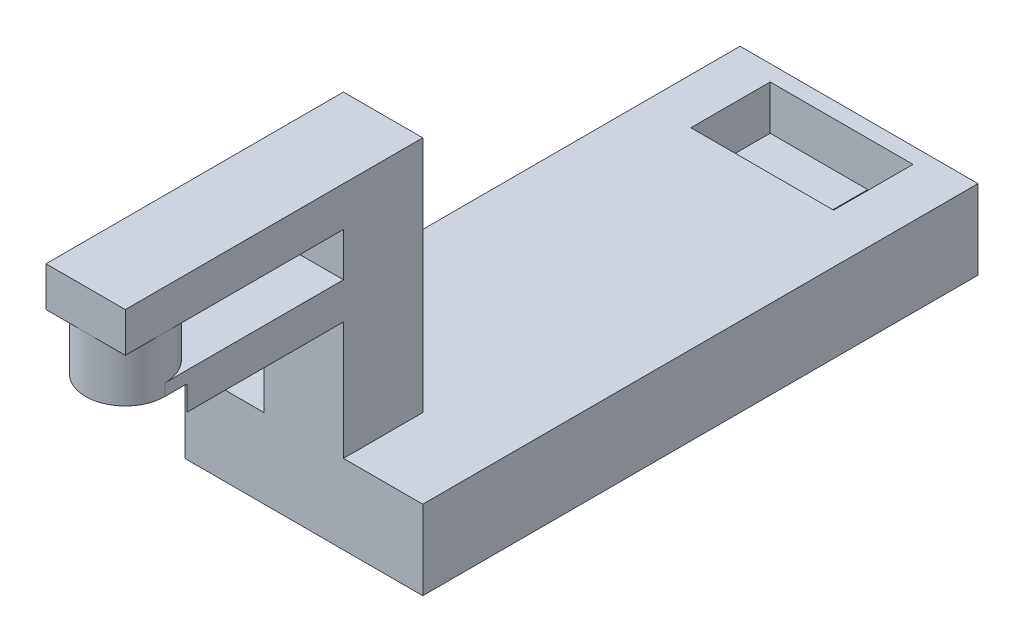
ISO-10303-21;
HEADER;
FILE_DESCRIPTION(('STEP AP214'),'2;1');
FILE_NAME('part.step','',(''),(''),'','','');
FILE_SCHEMA(('AUTOMOTIVE_DESIGN { 1 0 10303 214 1 1 1 1 }'));
ENDSEC;
DATA;
#1=APPLICATION_CONTEXT('core data for automotive mechanical design processes');
#2=APPLICATION_PROTOCOL_DEFINITION('international standard','automotive_design',2000,#1);
#3=PRODUCT_CONTEXT('',#1,'mechanical');
#4=PRODUCT('Part','Part','',(#3));
#5=PRODUCT_RELATED_PRODUCT_CATEGORY('part','',(#4));
#6=PRODUCT_DEFINITION_FORMATION('','',#4);
#7=PRODUCT_DEFINITION_CONTEXT('part definition',#1,'design');
#8=PRODUCT_DEFINITION('design','',#6,#7);
#9=PRODUCT_DEFINITION_SHAPE('','',#8);
#10=(LENGTH_UNIT() NAMED_UNIT(*) SI_UNIT(.MILLI.,.METRE.));
#11=(NAMED_UNIT(*) PLANE_ANGLE_UNIT() SI_UNIT($,.RADIAN.));
#12=(NAMED_UNIT(*) SI_UNIT($,.STERADIAN.) SOLID_ANGLE_UNIT());
#13=UNCERTAINTY_MEASURE_WITH_UNIT(LENGTH_MEASURE(1.E-05),#10,'distance_accuracy_value','');
#14=(GEOMETRIC_REPRESENTATION_CONTEXT(3) GLOBAL_UNCERTAINTY_ASSIGNED_CONTEXT((#13)) GLOBAL_UNIT_ASSIGNED_CONTEXT((#10,
#11,#12)) REPRESENTATION_CONTEXT('',''));
#15=CARTESIAN_POINT('',(0.,0.,0.));
#16=DIRECTION('',(0.,0.,1.));
#17=DIRECTION('',(1.,0.,0.));
#18=AXIS2_PLACEMENT_3D('',#15,#16,#17);
#19=CARTESIAN_POINT('',(0.,-19.812,0.));
#20=DIRECTION('',(0.,1.,0.));
#21=DIRECTION('',(0.,0.,1.));
#22=AXIS2_PLACEMENT_3D('',#19,#20,#21);
#23=PLANE('',#22);
#24=DIRECTION('',(0.,0.,1.));
#25=VECTOR('',#24,1.);
#26=CARTESIAN_POINT('',(3.937,-19.812,-73.66));
#27=LINE('',#26,#25);
#28=CARTESIAN_POINT('',(3.937,-19.812,-73.66));
#29=VERTEX_POINT('',#28);
#30=CARTESIAN_POINT('',(3.937,-19.812,-60.96));
#31=VERTEX_POINT('',#30);
#32=EDGE_CURVE('E273',#29,#31,#27,.T.);
#33=ORIENTED_EDGE('',*,*,#32,.F.);
#34=DIRECTION('',(-1.,0.,0.));
#35=VECTOR('',#34,1.);
#36=CARTESIAN_POINT('',(-11.684,-19.812,-73.66));
#37=LINE('',#36,#35);
#38=CARTESIAN_POINT('',(-11.684,-19.812,-73.66));
#39=VERTEX_POINT('',#38);
#40=EDGE_CURVE('E312',#29,#39,#37,.T.);
#41=ORIENTED_EDGE('',*,*,#40,.T.);
#42=DIRECTION('',(0.,0.,1.));
#43=VECTOR('',#42,1.);
#44=CARTESIAN_POINT('',(-11.684,-19.812,-73.66));
#45=LINE('',#44,#43);
#46=CARTESIAN_POINT('',(-11.684,-19.812,-60.96));
#47=VERTEX_POINT('',#46);
#48=EDGE_CURVE('E302',#39,#47,#45,.T.);
#49=ORIENTED_EDGE('',*,*,#48,.T.);
#50=DIRECTION('',(1.,0.,0.));
#51=VECTOR('',#50,1.);
#52=CARTESIAN_POINT('',(-11.684,-19.812,-60.96));
#53=LINE('',#52,#51);
#54=EDGE_CURVE('E307',#47,#31,#53,.T.);
#55=ORIENTED_EDGE('',*,*,#54,.T.);
#56=EDGE_LOOP('',(#33,#41,#49,#55));
#57=FACE_BOUND('',#56,.T.);
#58=ADVANCED_FACE('F61',(#57),#23,.T.);
#59=CARTESIAN_POINT('',(-6.35,-25.4,12.7));
#60=DIRECTION('',(1.,0.,0.));
#61=DIRECTION('',(0.,0.,-1.));
#62=AXIS2_PLACEMENT_3D('',#59,#60,#61);
#63=PLANE('',#62);
#64=DIRECTION('',(0.,0.,-1.));
#65=VECTOR('',#64,1.);
#66=CARTESIAN_POINT('',(-6.35,-12.7,12.7));
#67=LINE('',#66,#65);
#68=CARTESIAN_POINT('',(-6.35,-12.7,12.7));
#69=VERTEX_POINT('',#68);
#70=CARTESIAN_POINT('',(-6.35,-12.7,0.));
#71=VERTEX_POINT('',#70);
#72=EDGE_CURVE('E364',#69,#71,#67,.T.);
#73=ORIENTED_EDGE('',*,*,#72,.F.);
#74=DIRECTION('',(0.,-1.,0.));
#75=VECTOR('',#74,1.);
#76=CARTESIAN_POINT('',(-6.35,-25.4,12.7));
#77=LINE('',#76,#75);
#78=CARTESIAN_POINT('',(-6.35,6.223,12.7));
#79=VERTEX_POINT('',#78);
#80=EDGE_CURVE('E478',#79,#69,#77,.T.);
#81=ORIENTED_EDGE('',*,*,#80,.F.);
#82=DIRECTION('',(0.,0.,-1.));
#83=VECTOR('',#82,1.);
#84=CARTESIAN_POINT('',(-6.35,6.223,47.625));
#85=LINE('',#84,#83);
#86=CARTESIAN_POINT('',(-6.35,6.223,37.7764288630921));
#87=VERTEX_POINT('',#86);
#88=EDGE_CURVE('E436',#87,#79,#85,.T.);
#89=ORIENTED_EDGE('',*,*,#88,.F.);
#90=DIRECTION('',(0.,-1.,0.));
#91=VECTOR('',#90,1.);
#92=CARTESIAN_POINT('',(-6.35,47.0640986883574,37.7764288630921));
#93=LINE('',#92,#91);
#94=CARTESIAN_POINT('',(-6.35,10.1600000000001,37.7764288630921));
#95=VERTEX_POINT('',#94);
#96=EDGE_CURVE('E420',#95,#87,#93,.T.);
#97=ORIENTED_EDGE('',*,*,#96,.F.);
#98=DIRECTION('',(0.,0.,-1.));
#99=VECTOR('',#98,1.);
#100=CARTESIAN_POINT('',(-6.35,10.1600000000001,0.));
#101=LINE('',#100,#99);
#102=CARTESIAN_POINT('',(-6.35,10.1600000000001,41.275));
#103=VERTEX_POINT('',#102);
#104=EDGE_CURVE('E374',#103,#95,#101,.T.);
#105=ORIENTED_EDGE('',*,*,#104,.F.);
#106=DIRECTION('',(0.,-1.,0.));
#107=VECTOR('',#106,1.);
#108=CARTESIAN_POINT('',(-6.35,28.0302561210692,41.275));
#109=LINE('',#108,#107);
#110=CARTESIAN_POINT('',(-6.35,12.065,41.275));
#111=VERTEX_POINT('',#110);
#112=EDGE_CURVE('E369',#111,#103,#109,.T.);
#113=ORIENTED_EDGE('',*,*,#112,.F.);
#114=DIRECTION('',(0.,0.,-1.));
#115=VECTOR('',#114,1.);
#116=CARTESIAN_POINT('',(-6.35,12.065,47.625));
#117=LINE('',#116,#115);
#118=CARTESIAN_POINT('',(-6.35,12.065,12.7));
#119=VERTEX_POINT('',#118);
#120=EDGE_CURVE('E444',#111,#119,#117,.T.);
#121=ORIENTED_EDGE('',*,*,#120,.T.);
#122=CARTESIAN_POINT('',(-6.35,19.05,12.7));
#123=VERTEX_POINT('',#122);
#124=EDGE_CURVE('E480',#123,#119,#77,.T.);
#125=ORIENTED_EDGE('',*,*,#124,.F.);
#126=DIRECTION('',(0.,0.,-1.));
#127=VECTOR('',#126,1.);
#128=CARTESIAN_POINT('',(-6.35,19.05,47.625));
#129=LINE('',#128,#127);
#130=CARTESIAN_POINT('',(-6.35,19.05,41.275));
#131=VERTEX_POINT('',#130);
#132=EDGE_CURVE('E471',#131,#123,#129,.T.);
#133=ORIENTED_EDGE('',*,*,#132,.F.);
#134=CARTESIAN_POINT('',(-6.35,19.05,47.625));
#135=VERTEX_POINT('',#134);
#136=EDGE_CURVE('E472',#135,#131,#129,.T.);
#137=ORIENTED_EDGE('',*,*,#136,.F.);
#138=DIRECTION('',(0.,-1.,0.));
#139=VECTOR('',#138,1.);
#140=CARTESIAN_POINT('',(-6.35,25.4,47.625));
#141=LINE('',#140,#139);
#142=CARTESIAN_POINT('',(-6.35,25.4,47.625));
#143=VERTEX_POINT('',#142);
#144=EDGE_CURVE('E453',#143,#135,#141,.T.);
#145=ORIENTED_EDGE('',*,*,#144,.F.);
#146=DIRECTION('',(0.,0.,-1.));
#147=VECTOR('',#146,1.);
#148=CARTESIAN_POINT('',(-6.35,25.4,12.7));
#149=LINE('',#148,#147);
#150=CARTESIAN_POINT('',(-6.35,25.4,0.));
#151=VERTEX_POINT('',#150);
#152=EDGE_CURVE('E485',#143,#151,#149,.T.);
#153=ORIENTED_EDGE('',*,*,#152,.T.);
#154=DIRECTION('',(0.,-1.,0.));
#155=VECTOR('',#154,1.);
#156=CARTESIAN_POINT('',(-6.35,-25.4,0.));
#157=LINE('',#156,#155);
#158=EDGE_CURVE('E489',#151,#71,#157,.T.);
#159=ORIENTED_EDGE('',*,*,#158,.T.);
#160=EDGE_LOOP('',(#73,#81,#89,#97,#105,#113,#121,#125,#133,#137,#145,#153,#159));
#161=FACE_BOUND('',#160,.T.);
#162=ADVANCED_FACE('F570',(#161),#63,.F.);
#163=CARTESIAN_POINT('',(6.35,-25.4,12.7));
#164=DIRECTION('',(-1.,0.,0.));
#165=DIRECTION('',(0.,0.,1.));
#166=AXIS2_PLACEMENT_3D('',#163,#164,#165);
#167=PLANE('',#166);
#168=DIRECTION('',(0.,0.,1.));
#169=VECTOR('',#168,1.);
#170=CARTESIAN_POINT('',(6.35,-12.7,12.7));
#171=LINE('',#170,#169);
#172=CARTESIAN_POINT('',(6.35,-12.7,0.));
#173=VERTEX_POINT('',#172);
#174=CARTESIAN_POINT('',(6.35,-12.7,12.7));
#175=VERTEX_POINT('',#174);
#176=EDGE_CURVE('E362',#173,#175,#171,.T.);
#177=ORIENTED_EDGE('',*,*,#176,.F.);
#178=DIRECTION('',(0.,1.,0.));
#179=VECTOR('',#178,1.);
#180=CARTESIAN_POINT('',(6.35,-25.4,0.));
#181=LINE('',#180,#179);
#182=CARTESIAN_POINT('',(6.35,25.4,0.));
#183=VERTEX_POINT('',#182);
#184=EDGE_CURVE('E475',#173,#183,#181,.T.);
#185=ORIENTED_EDGE('',*,*,#184,.T.);
#186=DIRECTION('',(0.,0.,-1.));
#187=VECTOR('',#186,1.);
#188=CARTESIAN_POINT('',(6.35,25.4,12.7));
#189=LINE('',#188,#187);
#190=CARTESIAN_POINT('',(6.35,25.4,47.625));
#191=VERTEX_POINT('',#190);
#192=EDGE_CURVE('E494',#191,#183,#189,.T.);
#193=ORIENTED_EDGE('',*,*,#192,.F.);
#194=DIRECTION('',(0.,1.,0.));
#195=VECTOR('',#194,1.);
#196=CARTESIAN_POINT('',(6.35,25.4,47.625));
#197=LINE('',#196,#195);
#198=CARTESIAN_POINT('',(6.35,19.05,47.625));
#199=VERTEX_POINT('',#198);
#200=EDGE_CURVE('E459',#199,#191,#197,.T.);
#201=ORIENTED_EDGE('',*,*,#200,.F.);
#202=DIRECTION('',(0.,0.,-1.));
#203=VECTOR('',#202,1.);
#204=CARTESIAN_POINT('',(6.35,19.05,47.625));
#205=LINE('',#204,#203);
#206=CARTESIAN_POINT('',(6.35,19.05,41.275));
#207=VERTEX_POINT('',#206);
#208=EDGE_CURVE('E468',#199,#207,#205,.T.);
#209=ORIENTED_EDGE('',*,*,#208,.T.);
#210=CARTESIAN_POINT('',(6.35,19.05,12.7));
#211=VERTEX_POINT('',#210);
#212=EDGE_CURVE('E465',#207,#211,#205,.T.);
#213=ORIENTED_EDGE('',*,*,#212,.T.);
#214=DIRECTION('',(0.,1.,0.));
#215=VECTOR('',#214,1.);
#216=CARTESIAN_POINT('',(6.35,-25.4,12.7));
#217=LINE('',#216,#215);
#218=CARTESIAN_POINT('',(6.35,12.065,12.7));
#219=VERTEX_POINT('',#218);
#220=EDGE_CURVE('E479',#219,#211,#217,.T.);
#221=ORIENTED_EDGE('',*,*,#220,.F.);
#222=DIRECTION('',(0.,0.,-1.));
#223=VECTOR('',#222,1.);
#224=CARTESIAN_POINT('',(6.35,12.065,47.625));
#225=LINE('',#224,#223);
#226=CARTESIAN_POINT('',(6.35,12.065,41.275));
#227=VERTEX_POINT('',#226);
#228=EDGE_CURVE('E442',#227,#219,#225,.T.);
#229=ORIENTED_EDGE('',*,*,#228,.F.);
#230=DIRECTION('',(0.,-1.,0.));
#231=VECTOR('',#230,1.);
#232=CARTESIAN_POINT('',(6.35,28.0302561210692,41.275));
#233=LINE('',#232,#231);
#234=CARTESIAN_POINT('',(6.35,10.1600000000001,41.275));
#235=VERTEX_POINT('',#234);
#236=EDGE_CURVE('E366',#227,#235,#233,.T.);
#237=ORIENTED_EDGE('',*,*,#236,.T.);
#238=DIRECTION('',(0.,0.,1.));
#239=VECTOR('',#238,1.);
#240=CARTESIAN_POINT('',(6.35,10.1600000000001,0.));
#241=LINE('',#240,#239);
#242=CARTESIAN_POINT('',(6.34999999999992,10.1600000000001,37.7764288630922));
#243=VERTEX_POINT('',#242);
#244=EDGE_CURVE('E400',#243,#235,#241,.T.);
#245=ORIENTED_EDGE('',*,*,#244,.F.);
#246=DIRECTION('',(0.,-1.,0.));
#247=VECTOR('',#246,1.);
#248=CARTESIAN_POINT('',(6.35,47.0640986883574,37.7764288630921));
#249=LINE('',#248,#247);
#250=CARTESIAN_POINT('',(6.35,6.223,37.7764288630921));
#251=VERTEX_POINT('',#250);
#252=EDGE_CURVE('E404',#243,#251,#249,.T.);
#253=ORIENTED_EDGE('',*,*,#252,.T.);
#254=DIRECTION('',(0.,0.,-1.));
#255=VECTOR('',#254,1.);
#256=CARTESIAN_POINT('',(6.35,6.223,47.625));
#257=LINE('',#256,#255);
#258=CARTESIAN_POINT('',(6.35,6.223,12.7));
#259=VERTEX_POINT('',#258);
#260=EDGE_CURVE('E439',#251,#259,#257,.T.);
#261=ORIENTED_EDGE('',*,*,#260,.T.);
#262=EDGE_CURVE('E476',#175,#259,#217,.T.);
#263=ORIENTED_EDGE('',*,*,#262,.F.);
#264=EDGE_LOOP('',(#177,#185,#193,#201,#209,#213,#221,#229,#237,#245,#253,#261,#263));
#265=FACE_BOUND('',#264,.T.);
#266=ADVANCED_FACE('F63',(#265),#167,.F.);
#267=CARTESIAN_POINT('',(0.,0.,0.));
#268=DIRECTION('',(0.,0.,-1.));
#269=DIRECTION('',(-1.,0.,0.));
#270=AXIS2_PLACEMENT_3D('',#267,#268,#269);
#271=PLANE('',#270);
#272=ORIENTED_EDGE('',*,*,#184,.F.);
#273=DIRECTION('',(-1.,0.,0.));
#274=VECTOR('',#273,1.);
#275=CARTESIAN_POINT('',(0.,-12.7,0.));
#276=LINE('',#275,#274);
#277=EDGE_CURVE('E12',#173,#71,#276,.T.);
#278=ORIENTED_EDGE('',*,*,#277,.T.);
#279=ORIENTED_EDGE('',*,*,#158,.F.);
#280=DIRECTION('',(-1.,0.,0.));
#281=VECTOR('',#280,1.);
#282=CARTESIAN_POINT('',(-6.35,25.4,0.));
#283=LINE('',#282,#281);
#284=EDGE_CURVE('E487',#183,#151,#283,.T.);
#285=ORIENTED_EDGE('',*,*,#284,.F.);
#286=EDGE_LOOP('',(#272,#278,#279,#285));
#287=FACE_BOUND('',#286,.T.);
#288=ADVANCED_FACE('F692',(#287),#271,.T.);
#289=CARTESIAN_POINT('',(13.800000000144,10.1600000000001,30.9250000001918));
#290=DIRECTION('',(0.,1.,0.));
#291=DIRECTION('',(1.39148345623674E-11,0.,-1.));
#292=AXIS2_PLACEMENT_3D('',#289,#290,#291);
#293=PLANE('',#292);
#294=ORIENTED_EDGE('',*,*,#244,.T.);
#295=CARTESIAN_POINT('',(0.,10.1600000000001,41.275));
#296=DIRECTION('',(0.,1.,0.));
#297=DIRECTION('',(-1.,0.,0.));
#298=AXIS2_PLACEMENT_3D('',#295,#296,#297);
#299=CIRCLE('',#298,6.35);
#300=EDGE_CURVE('E69',#103,#235,#299,.T.);
#301=ORIENTED_EDGE('',*,*,#300,.F.);
#302=ORIENTED_EDGE('',*,*,#104,.T.);
#303=CARTESIAN_POINT('',(0.,10.1600000000001,41.275));
#304=DIRECTION('',(0.,1.,0.));
#305=DIRECTION('',(-1.,0.,0.));
#306=AXIS2_PLACEMENT_3D('',#303,#304,#305);
#307=CIRCLE('',#306,7.25000000000025);
#308=CARTESIAN_POINT('',(-5.79999999993962,10.1600000000001,36.9249999999191));
#309=VERTEX_POINT('',#308);
#310=EDGE_CURVE('E416',#95,#309,#307,.F.);
#311=ORIENTED_EDGE('',*,*,#310,.T.);
#312=CARTESIAN_POINT('',(-13.799999999856,10.1600000000001,30.9249999998077));
#313=DIRECTION('',(0.,1.,0.));
#314=DIRECTION('',(-1.,0.,0.));
#315=AXIS2_PLACEMENT_3D('',#312,#313,#314);
#316=CIRCLE('',#315,10.);
#317=CARTESIAN_POINT('',(-3.79999999985598,10.1600000000001,30.9249999999468));
#318=VERTEX_POINT('',#317);
#319=EDGE_CURVE('E399',#318,#309,#316,.F.);
#320=ORIENTED_EDGE('',*,*,#319,.F.);
#321=DIRECTION('',(-1.39145663974111E-11,0.,1.));
#322=VECTOR('',#321,1.);
#323=CARTESIAN_POINT('',(-3.79999999942567,10.1600000000001,-5.28753523021707E-11));
#324=LINE('',#323,#322);
#325=CARTESIAN_POINT('',(-3.79999999965909,10.1600000000001,16.7749999999468));
#326=VERTEX_POINT('',#325);
#327=EDGE_CURVE('E410',#326,#318,#324,.T.);
#328=ORIENTED_EDGE('',*,*,#327,.F.);
#329=CARTESIAN_POINT('',(3.4090928864583E-10,10.1600000000001,16.7749999999997));
#330=DIRECTION('',(0.,1.,0.));
#331=DIRECTION('',(-1.,0.,0.));
#332=AXIS2_PLACEMENT_3D('',#329,#330,#331);
#333=CIRCLE('',#332,3.8);
#334=CARTESIAN_POINT('',(3.80000000034091,10.1600000000001,16.7750000000526));
#335=VERTEX_POINT('',#334);
#336=EDGE_CURVE('E391',#326,#335,#333,.F.);
#337=ORIENTED_EDGE('',*,*,#336,.T.);
#338=DIRECTION('',(1.39148115880085E-11,0.,-1.));
#339=VECTOR('',#338,1.);
#340=CARTESIAN_POINT('',(3.80000000057433,10.1600000000001,5.28762840424239E-11));
#341=LINE('',#340,#339);
#342=CARTESIAN_POINT('',(3.80000000014402,10.1600000000001,30.9250000000526));
#343=VERTEX_POINT('',#342);
#344=EDGE_CURVE('E408',#343,#335,#341,.T.);
#345=ORIENTED_EDGE('',*,*,#344,.F.);
#346=CARTESIAN_POINT('',(13.800000000144,10.1600000000001,30.9250000001918));
#347=DIRECTION('',(0.,1.,0.));
#348=DIRECTION('',(-1.,0.,0.));
#349=AXIS2_PLACEMENT_3D('',#346,#347,#348);
#350=CIRCLE('',#349,10.);
#351=CARTESIAN_POINT('',(5.8000000000606,10.1600000000001,36.9250000000805));
#352=VERTEX_POINT('',#351);
#353=EDGE_CURVE('E371',#352,#343,#350,.F.);
#354=ORIENTED_EDGE('',*,*,#353,.F.);
#355=CARTESIAN_POINT('',(0.,10.1600000000001,41.275));
#356=DIRECTION('',(0.,1.,0.));
#357=DIRECTION('',(-1.,0.,0.));
#358=AXIS2_PLACEMENT_3D('',#355,#356,#357);
#359=CIRCLE('',#358,7.25000000000025);
#360=EDGE_CURVE('E379',#352,#243,#359,.F.);
#361=ORIENTED_EDGE('',*,*,#360,.T.);
#362=EDGE_LOOP('',(#294,#301,#302,#311,#320,#328,#337,#345,#354,#361));
#363=FACE_BOUND('',#362,.T.);
#364=ADVANCED_FACE('F508',(#363),#293,.F.);
#365=CARTESIAN_POINT('',(-6.35,19.05,47.625));
#366=DIRECTION('',(0.,1.,0.));
#367=DIRECTION('',(0.,0.,1.));
#368=AXIS2_PLACEMENT_3D('',#365,#366,#367);
#369=PLANE('',#368);
#370=CARTESIAN_POINT('',(0.,19.05,41.275));
#371=DIRECTION('',(0.,1.,0.));
#372=DIRECTION('',(0.,0.,1.));
#373=AXIS2_PLACEMENT_3D('',#370,#371,#372);
#374=CIRCLE('',#373,6.35);
#375=CARTESIAN_POINT('',(0.,19.05,47.625));
#376=VERTEX_POINT('',#375);
#377=EDGE_CURVE('E433',#131,#376,#374,.T.);
#378=ORIENTED_EDGE('',*,*,#377,.T.);
#379=DIRECTION('',(1.,0.,0.));
#380=VECTOR('',#379,1.);
#381=CARTESIAN_POINT('',(-6.35,19.05,47.625));
#382=LINE('',#381,#380);
#383=EDGE_CURVE('E457',#135,#376,#382,.T.);
#384=ORIENTED_EDGE('',*,*,#383,.F.);
#385=ORIENTED_EDGE('',*,*,#136,.T.);
#386=EDGE_LOOP('',(#378,#384,#385));
#387=FACE_BOUND('',#386,.T.);
#388=ADVANCED_FACE('F563',(#387),#369,.F.);
#389=EDGE_CURVE('E437',#207,#131,#374,.T.);
#390=ORIENTED_EDGE('',*,*,#389,.T.);
#391=ORIENTED_EDGE('',*,*,#132,.T.);
#392=DIRECTION('',(1.,0.,0.));
#393=VECTOR('',#392,1.);
#394=CARTESIAN_POINT('',(-6.35,19.05,12.7));
#395=LINE('',#394,#393);
#396=EDGE_CURVE('E452',#123,#211,#395,.T.);
#397=ORIENTED_EDGE('',*,*,#396,.T.);
#398=ORIENTED_EDGE('',*,*,#212,.F.);
#399=EDGE_LOOP('',(#390,#391,#397,#398));
#400=FACE_BOUND('',#399,.T.);
#401=ADVANCED_FACE('F564',(#400),#369,.F.);
#402=CARTESIAN_POINT('',(0.,0.,12.7));
#403=DIRECTION('',(0.,0.,-1.));
#404=DIRECTION('',(-1.,0.,0.));
#405=AXIS2_PLACEMENT_3D('',#402,#403,#404);
#406=PLANE('',#405);
#407=DIRECTION('',(1.,0.,0.));
#408=VECTOR('',#407,1.);
#409=CARTESIAN_POINT('',(-6.35,-25.4,12.7));
#410=LINE('',#409,#408);
#411=CARTESIAN_POINT('',(-19.05,-25.4,12.7));
#412=VERTEX_POINT('',#411);
#413=CARTESIAN_POINT('',(19.05,-25.4,12.7));
#414=VERTEX_POINT('',#413);
#415=EDGE_CURVE('E483',#412,#414,#410,.T.);
#416=ORIENTED_EDGE('',*,*,#415,.T.);
#417=DIRECTION('',(0.,-1.,0.));
#418=VECTOR('',#417,1.);
#419=CARTESIAN_POINT('',(19.05,0.,12.7));
#420=LINE('',#419,#418);
#421=CARTESIAN_POINT('',(19.05,-12.7,12.7));
#422=VERTEX_POINT('',#421);
#423=EDGE_CURVE('E338',#422,#414,#420,.T.);
#424=ORIENTED_EDGE('',*,*,#423,.F.);
#425=DIRECTION('',(1.,0.,0.));
#426=VECTOR('',#425,1.);
#427=CARTESIAN_POINT('',(0.,-12.7,12.7));
#428=LINE('',#427,#426);
#429=EDGE_CURVE('E346',#175,#422,#428,.T.);
#430=ORIENTED_EDGE('',*,*,#429,.F.);
#431=ORIENTED_EDGE('',*,*,#262,.T.);
#432=DIRECTION('',(1.,0.,0.));
#433=VECTOR('',#432,1.);
#434=CARTESIAN_POINT('',(-6.35,6.223,12.7));
#435=LINE('',#434,#433);
#436=EDGE_CURVE('E449',#79,#259,#435,.T.);
#437=ORIENTED_EDGE('',*,*,#436,.F.);
#438=ORIENTED_EDGE('',*,*,#80,.T.);
#439=CARTESIAN_POINT('',(-19.05,-12.7,12.7));
#440=VERTEX_POINT('',#439);
#441=EDGE_CURVE('E347',#440,#69,#428,.T.);
#442=ORIENTED_EDGE('',*,*,#441,.F.);
#443=DIRECTION('',(0.,1.,0.));
#444=VECTOR('',#443,1.);
#445=CARTESIAN_POINT('',(-19.05,0.,12.7));
#446=LINE('',#445,#444);
#447=EDGE_CURVE('E327',#412,#440,#446,.T.);
#448=ORIENTED_EDGE('',*,*,#447,.F.);
#449=EDGE_LOOP('',(#416,#424,#430,#431,#437,#438,#442,#448));
#450=FACE_BOUND('',#449,.T.);
#451=ADVANCED_FACE('F530',(#450),#406,.F.);
#452=DIRECTION('',(-1.,0.,0.));
#453=VECTOR('',#452,1.);
#454=CARTESIAN_POINT('',(-6.35,12.065,12.7));
#455=LINE('',#454,#453);
#456=EDGE_CURVE('E446',#219,#119,#455,.T.);
#457=ORIENTED_EDGE('',*,*,#456,.F.);
#458=ORIENTED_EDGE('',*,*,#220,.T.);
#459=ORIENTED_EDGE('',*,*,#396,.F.);
#460=ORIENTED_EDGE('',*,*,#124,.T.);
#461=EDGE_LOOP('',(#457,#458,#459,#460));
#462=FACE_BOUND('',#461,.T.);
#463=ADVANCED_FACE('F566',(#462),#406,.F.);
#464=CARTESIAN_POINT('',(-6.35,25.4,12.7));
#465=DIRECTION('',(0.,-1.,0.));
#466=DIRECTION('',(0.,0.,-1.));
#467=AXIS2_PLACEMENT_3D('',#464,#465,#466);
#468=PLANE('',#467);
#469=ORIENTED_EDGE('',*,*,#284,.T.);
#470=ORIENTED_EDGE('',*,*,#152,.F.);
#471=DIRECTION('',(-1.,0.,0.));
#472=VECTOR('',#471,1.);
#473=CARTESIAN_POINT('',(-6.35,25.4,47.625));
#474=LINE('',#473,#472);
#475=EDGE_CURVE('E462',#191,#143,#474,.T.);
#476=ORIENTED_EDGE('',*,*,#475,.F.);
#477=ORIENTED_EDGE('',*,*,#192,.T.);
#478=EDGE_LOOP('',(#469,#470,#476,#477));
#479=FACE_BOUND('',#478,.T.);
#480=ADVANCED_FACE('F553',(#479),#468,.F.);
#481=CARTESIAN_POINT('',(-6.35,-25.4,12.7));
#482=DIRECTION('',(0.,1.,0.));
#483=DIRECTION('',(0.,0.,1.));
#484=AXIS2_PLACEMENT_3D('',#481,#482,#483);
#485=PLANE('',#484);
#486=DIRECTION('',(-1.,0.,0.));
#487=VECTOR('',#486,1.);
#488=CARTESIAN_POINT('',(3.937,-25.4,-73.66));
#489=LINE('',#488,#487);
#490=CARTESIAN_POINT('',(6.731,-25.4,-73.66));
#491=VERTEX_POINT('',#490);
#492=CARTESIAN_POINT('',(3.937,-25.4,-73.66));
#493=VERTEX_POINT('',#492);
#494=EDGE_CURVE('E277',#491,#493,#489,.T.);
#495=ORIENTED_EDGE('',*,*,#494,.T.);
#496=DIRECTION('',(0.,0.,1.));
#497=VECTOR('',#496,1.);
#498=CARTESIAN_POINT('',(3.937,-25.4,-73.66));
#499=LINE('',#498,#497);
#500=CARTESIAN_POINT('',(3.937,-25.4,-60.96));
#501=VERTEX_POINT('',#500);
#502=EDGE_CURVE('E270',#493,#501,#499,.T.);
#503=ORIENTED_EDGE('',*,*,#502,.T.);
#504=DIRECTION('',(1.,0.,0.));
#505=VECTOR('',#504,1.);
#506=CARTESIAN_POINT('',(3.937,-25.4,-60.96));
#507=LINE('',#506,#505);
#508=CARTESIAN_POINT('',(6.731,-25.4,-60.96));
#509=VERTEX_POINT('',#508);
#510=EDGE_CURVE('E280',#501,#509,#507,.T.);
#511=ORIENTED_EDGE('',*,*,#510,.T.);
#512=DIRECTION('',(0.,0.,-1.));
#513=VECTOR('',#512,1.);
#514=CARTESIAN_POINT('',(6.731,-25.4,-73.66));
#515=LINE('',#514,#513);
#516=EDGE_CURVE('E81',#509,#491,#515,.T.);
#517=ORIENTED_EDGE('',*,*,#516,.T.);
#518=EDGE_LOOP('',(#495,#503,#511,#517));
#519=FACE_BOUND('',#518,.T.);
#520=ORIENTED_EDGE('',*,*,#415,.F.);
#521=DIRECTION('',(0.,0.,1.));
#522=VECTOR('',#521,1.);
#523=CARTESIAN_POINT('',(-19.05,-25.4,-76.2));
#524=LINE('',#523,#522);
#525=CARTESIAN_POINT('',(-19.05,-25.4,-76.2));
#526=VERTEX_POINT('',#525);
#527=EDGE_CURVE('E359',#526,#412,#524,.T.);
#528=ORIENTED_EDGE('',*,*,#527,.F.);
#529=DIRECTION('',(-1.,0.,0.));
#530=VECTOR('',#529,1.);
#531=CARTESIAN_POINT('',(0.,-25.4,-76.2));
#532=LINE('',#531,#530);
#533=CARTESIAN_POINT('',(19.05,-25.4,-76.2));
#534=VERTEX_POINT('',#533);
#535=EDGE_CURVE('E334',#534,#526,#532,.T.);
#536=ORIENTED_EDGE('',*,*,#535,.F.);
#537=DIRECTION('',(0.,0.,1.));
#538=VECTOR('',#537,1.);
#539=CARTESIAN_POINT('',(19.05,-25.4,-76.2));
#540=LINE('',#539,#538);
#541=EDGE_CURVE('E344',#534,#414,#540,.T.);
#542=ORIENTED_EDGE('',*,*,#541,.T.);
#543=EDGE_LOOP('',(#520,#528,#536,#542));
#544=FACE_BOUND('',#543,.T.);
#545=ADVANCED_FACE('F286',(#519,#544),#485,.F.);
#546=EDGE_CURVE('E434',#376,#207,#374,.T.);
#547=ORIENTED_EDGE('',*,*,#546,.T.);
#548=ORIENTED_EDGE('',*,*,#208,.F.);
#549=EDGE_CURVE('E456',#376,#199,#382,.T.);
#550=ORIENTED_EDGE('',*,*,#549,.F.);
#551=EDGE_LOOP('',(#547,#548,#550));
#552=FACE_BOUND('',#551,.T.);
#553=ADVANCED_FACE('F552',(#552),#369,.F.);
#554=CARTESIAN_POINT('',(0.,0.,47.625));
#555=DIRECTION('',(0.,0.,1.));
#556=DIRECTION('',(1.,0.,0.));
#557=AXIS2_PLACEMENT_3D('',#554,#555,#556);
#558=PLANE('',#557);
#559=ORIENTED_EDGE('',*,*,#144,.T.);
#560=ORIENTED_EDGE('',*,*,#383,.T.);
#561=ORIENTED_EDGE('',*,*,#549,.T.);
#562=ORIENTED_EDGE('',*,*,#200,.T.);
#563=ORIENTED_EDGE('',*,*,#475,.T.);
#564=EDGE_LOOP('',(#559,#560,#561,#562,#563));
#565=FACE_BOUND('',#564,.T.);
#566=ADVANCED_FACE('F560',(#565),#558,.T.);
#567=CARTESIAN_POINT('',(-6.35,6.223,47.625));
#568=DIRECTION('',(0.,1.,0.));
#569=DIRECTION('',(-1.,0.,0.));
#570=AXIS2_PLACEMENT_3D('',#567,#568,#569);
#571=PLANE('',#570);
#572=CARTESIAN_POINT('',(-13.799999999856,6.223,30.9249999998077));
#573=DIRECTION('',(0.,-1.,0.));
#574=DIRECTION('',(1.,0.,0.));
#575=AXIS2_PLACEMENT_3D('',#572,#573,#574);
#576=CIRCLE('',#575,10.);
#577=CARTESIAN_POINT('',(-3.79999999985598,6.223,30.9249999999468));
#578=VERTEX_POINT('',#577);
#579=CARTESIAN_POINT('',(-5.79999999993954,6.223,36.9249999999191));
#580=VERTEX_POINT('',#579);
#581=EDGE_CURVE('E393',#578,#580,#576,.T.);
#582=ORIENTED_EDGE('',*,*,#581,.T.);
#583=CARTESIAN_POINT('',(0.,6.223,41.275));
#584=DIRECTION('',(0.,-1.,0.));
#585=DIRECTION('',(1.,0.,0.));
#586=AXIS2_PLACEMENT_3D('',#583,#584,#585);
#587=CIRCLE('',#586,7.25000000000025);
#588=EDGE_CURVE('E387',#87,#580,#587,.T.);
#589=ORIENTED_EDGE('',*,*,#588,.F.);
#590=ORIENTED_EDGE('',*,*,#88,.T.);
#591=ORIENTED_EDGE('',*,*,#436,.T.);
#592=ORIENTED_EDGE('',*,*,#260,.F.);
#593=CARTESIAN_POINT('',(0.,6.223,41.275));
#594=DIRECTION('',(0.,-1.,0.));
#595=DIRECTION('',(1.,0.,0.));
#596=AXIS2_PLACEMENT_3D('',#593,#594,#595);
#597=CIRCLE('',#596,7.25000000000025);
#598=CARTESIAN_POINT('',(5.80000000006067,6.223,36.9250000000805));
#599=VERTEX_POINT('',#598);
#600=EDGE_CURVE('E372',#599,#251,#597,.T.);
#601=ORIENTED_EDGE('',*,*,#600,.F.);
#602=CARTESIAN_POINT('',(13.800000000144,6.223,30.9250000001918));
#603=DIRECTION('',(0.,-1.,0.));
#604=DIRECTION('',(1.,0.,0.));
#605=AXIS2_PLACEMENT_3D('',#602,#603,#604);
#606=CIRCLE('',#605,10.);
#607=CARTESIAN_POINT('',(3.80000000014402,6.223,30.9250000000526));
#608=VERTEX_POINT('',#607);
#609=EDGE_CURVE('E376',#599,#608,#606,.T.);
#610=ORIENTED_EDGE('',*,*,#609,.T.);
#611=DIRECTION('',(1.39148115880085E-11,0.,-1.));
#612=VECTOR('',#611,1.);
#613=CARTESIAN_POINT('',(3.80000000057433,6.223,5.28762840424239E-11));
#614=LINE('',#613,#612);
#615=CARTESIAN_POINT('',(3.80000000034091,6.223,16.7750000000526));
#616=VERTEX_POINT('',#615);
#617=EDGE_CURVE('E381',#608,#616,#614,.T.);
#618=ORIENTED_EDGE('',*,*,#617,.T.);
#619=CARTESIAN_POINT('',(3.40909557527969E-10,6.223,16.7749999999997));
#620=DIRECTION('',(0.,-1.,0.));
#621=DIRECTION('',(1.,0.,0.));
#622=AXIS2_PLACEMENT_3D('',#619,#620,#621);
#623=CIRCLE('',#622,3.8);
#624=CARTESIAN_POINT('',(-3.79999999965909,6.223,16.7749999999468));
#625=VERTEX_POINT('',#624);
#626=EDGE_CURVE('E375',#625,#616,#623,.T.);
#627=ORIENTED_EDGE('',*,*,#626,.F.);
#628=DIRECTION('',(-1.39145663974111E-11,0.,1.));
#629=VECTOR('',#628,1.);
#630=CARTESIAN_POINT('',(-3.79999999942567,6.223,-5.28753523021708E-11));
#631=LINE('',#630,#629);
#632=EDGE_CURVE('E388',#625,#578,#631,.T.);
#633=ORIENTED_EDGE('',*,*,#632,.T.);
#634=EDGE_LOOP('',(#582,#589,#590,#591,#592,#601,#610,#618,#627,#633));
#635=FACE_BOUND('',#634,.T.);
#636=ADVANCED_FACE('F522',(#635),#571,.F.);
#637=CARTESIAN_POINT('',(-6.35,12.065,47.625));
#638=DIRECTION('',(0.,-1.,0.));
#639=DIRECTION('',(0.,0.,-1.));
#640=AXIS2_PLACEMENT_3D('',#637,#638,#639);
#641=PLANE('',#640);
#642=CARTESIAN_POINT('',(0.,12.065,41.275));
#643=DIRECTION('',(0.,1.,0.));
#644=DIRECTION('',(-1.,0.,0.));
#645=AXIS2_PLACEMENT_3D('',#642,#643,#644);
#646=CIRCLE('',#645,6.35);
#647=EDGE_CURVE('E403',#227,#111,#646,.T.);
#648=ORIENTED_EDGE('',*,*,#647,.F.);
#649=ORIENTED_EDGE('',*,*,#228,.T.);
#650=ORIENTED_EDGE('',*,*,#456,.T.);
#651=ORIENTED_EDGE('',*,*,#120,.F.);
#652=EDGE_LOOP('',(#648,#649,#650,#651));
#653=FACE_BOUND('',#652,.T.);
#654=ADVANCED_FACE('F779',(#653),#641,.F.);
#655=CARTESIAN_POINT('',(0.,37.0105122421383,41.275));
#656=DIRECTION('',(0.,-1.,0.));
#657=DIRECTION('',(1.,0.,0.));
#658=AXIS2_PLACEMENT_3D('',#655,#656,#657);
#659=CYLINDRICAL_SURFACE('',#658,6.35);
#660=ORIENTED_EDGE('',*,*,#236,.F.);
#661=ORIENTED_EDGE('',*,*,#647,.T.);
#662=ORIENTED_EDGE('',*,*,#112,.T.);
#663=ORIENTED_EDGE('',*,*,#300,.T.);
#664=EDGE_LOOP('',(#660,#661,#662,#663));
#665=FACE_BOUND('',#664,.T.);
#666=ORIENTED_EDGE('',*,*,#389,.F.);
#667=ORIENTED_EDGE('',*,*,#546,.F.);
#668=ORIENTED_EDGE('',*,*,#377,.F.);
#669=EDGE_LOOP('',(#666,#667,#668));
#670=FACE_BOUND('',#669,.T.);
#671=ADVANCED_FACE('F498',(#665,#670),#659,.T.);
#672=CARTESIAN_POINT('',(0.,47.0640986883574,41.275));
#673=DIRECTION('',(0.,-1.,0.));
#674=DIRECTION('',(1.,0.,0.));
#675=AXIS2_PLACEMENT_3D('',#672,#673,#674);
#676=CYLINDRICAL_SURFACE('',#675,7.25000000000025);
#677=ORIENTED_EDGE('',*,*,#96,.T.);
#678=ORIENTED_EDGE('',*,*,#588,.T.);
#679=DIRECTION('',(0.,-1.,0.));
#680=VECTOR('',#679,1.);
#681=CARTESIAN_POINT('',(-5.79999999993955,47.0640986883574,36.9249999999191));
#682=LINE('',#681,#680);
#683=EDGE_CURVE('E419',#309,#580,#682,.T.);
#684=ORIENTED_EDGE('',*,*,#683,.F.);
#685=ORIENTED_EDGE('',*,*,#310,.F.);
#686=EDGE_LOOP('',(#677,#678,#684,#685));
#687=FACE_BOUND('',#686,.T.);
#688=ADVANCED_FACE('F762',(#687),#676,.F.);
#689=CARTESIAN_POINT('',(-13.799999999856,47.0640986883574,30.9249999998077));
#690=DIRECTION('',(0.,-1.,0.));
#691=DIRECTION('',(1.,0.,0.));
#692=AXIS2_PLACEMENT_3D('',#689,#690,#691);
#693=CYLINDRICAL_SURFACE('',#692,10.);
#694=ORIENTED_EDGE('',*,*,#319,.T.);
#695=ORIENTED_EDGE('',*,*,#683,.T.);
#696=ORIENTED_EDGE('',*,*,#581,.F.);
#697=DIRECTION('',(0.,-1.,0.));
#698=VECTOR('',#697,1.);
#699=CARTESIAN_POINT('',(-3.79999999985598,47.0640986883574,30.9249999999468));
#700=LINE('',#699,#698);
#701=EDGE_CURVE('E396',#318,#578,#700,.T.);
#702=ORIENTED_EDGE('',*,*,#701,.F.);
#703=EDGE_LOOP('',(#694,#695,#696,#702));
#704=FACE_BOUND('',#703,.T.);
#705=ADVANCED_FACE('F753',(#704),#693,.T.);
#706=CARTESIAN_POINT('',(-3.79999999942568,47.0640986883574,-5.28753523021708E-11));
#707=DIRECTION('',(1.,0.,1.39145663974111E-11));
#708=DIRECTION('',(1.39145663974111E-11,0.,-1.));
#709=AXIS2_PLACEMENT_3D('',#706,#707,#708);
#710=PLANE('',#709);
#711=ORIENTED_EDGE('',*,*,#327,.T.);
#712=ORIENTED_EDGE('',*,*,#701,.T.);
#713=ORIENTED_EDGE('',*,*,#632,.F.);
#714=DIRECTION('',(0.,-1.,0.));
#715=VECTOR('',#714,1.);
#716=CARTESIAN_POINT('',(-3.79999999965909,47.0640986883574,16.7749999999468));
#717=LINE('',#716,#715);
#718=EDGE_CURVE('E392',#326,#625,#717,.T.);
#719=ORIENTED_EDGE('',*,*,#718,.F.);
#720=EDGE_LOOP('',(#711,#712,#713,#719));
#721=FACE_BOUND('',#720,.T.);
#722=ADVANCED_FACE('F744',(#721),#710,.T.);
#723=CARTESIAN_POINT('',(3.40906768236131E-10,47.0640986883574,16.7749999999997));
#724=DIRECTION('',(0.,-1.,0.));
#725=DIRECTION('',(1.,0.,0.));
#726=AXIS2_PLACEMENT_3D('',#723,#724,#725);
#727=CYLINDRICAL_SURFACE('',#726,3.8);
#728=ORIENTED_EDGE('',*,*,#718,.T.);
#729=ORIENTED_EDGE('',*,*,#626,.T.);
#730=DIRECTION('',(0.,-1.,0.));
#731=VECTOR('',#730,1.);
#732=CARTESIAN_POINT('',(3.80000000034091,47.0640986883574,16.7750000000526));
#733=LINE('',#732,#731);
#734=EDGE_CURVE('E413',#335,#616,#733,.T.);
#735=ORIENTED_EDGE('',*,*,#734,.F.);
#736=ORIENTED_EDGE('',*,*,#336,.F.);
#737=EDGE_LOOP('',(#728,#729,#735,#736));
#738=FACE_BOUND('',#737,.T.);
#739=ADVANCED_FACE('F735',(#738),#727,.F.);
#740=CARTESIAN_POINT('',(3.80000000057433,47.0640986883574,5.28762840424239E-11));
#741=DIRECTION('',(-1.,0.,-1.39148115880085E-11));
#742=DIRECTION('',(-1.39148115880085E-11,0.,1.));
#743=AXIS2_PLACEMENT_3D('',#740,#741,#742);
#744=PLANE('',#743);
#745=ORIENTED_EDGE('',*,*,#344,.T.);
#746=ORIENTED_EDGE('',*,*,#734,.T.);
#747=ORIENTED_EDGE('',*,*,#617,.F.);
#748=DIRECTION('',(0.,-1.,0.));
#749=VECTOR('',#748,1.);
#750=CARTESIAN_POINT('',(3.80000000014402,47.0640986883574,30.9250000000526));
#751=LINE('',#750,#749);
#752=EDGE_CURVE('E384',#343,#608,#751,.T.);
#753=ORIENTED_EDGE('',*,*,#752,.F.);
#754=EDGE_LOOP('',(#745,#746,#747,#753));
#755=FACE_BOUND('',#754,.T.);
#756=ADVANCED_FACE('F727',(#755),#744,.T.);
#757=CARTESIAN_POINT('',(13.800000000144,47.0640986883574,30.9250000001918));
#758=DIRECTION('',(0.,-1.,0.));
#759=DIRECTION('',(1.,0.,0.));
#760=AXIS2_PLACEMENT_3D('',#757,#758,#759);
#761=CYLINDRICAL_SURFACE('',#760,10.);
#762=ORIENTED_EDGE('',*,*,#353,.T.);
#763=ORIENTED_EDGE('',*,*,#752,.T.);
#764=ORIENTED_EDGE('',*,*,#609,.F.);
#765=DIRECTION('',(0.,-1.,0.));
#766=VECTOR('',#765,1.);
#767=CARTESIAN_POINT('',(5.80000000006067,47.0640986883574,36.9250000000805));
#768=LINE('',#767,#766);
#769=EDGE_CURVE('E380',#352,#599,#768,.T.);
#770=ORIENTED_EDGE('',*,*,#769,.F.);
#771=EDGE_LOOP('',(#762,#763,#764,#770));
#772=FACE_BOUND('',#771,.T.);
#773=ADVANCED_FACE('F516',(#772),#761,.T.);
#774=CARTESIAN_POINT('',(0.,47.0640986883574,41.275));
#775=DIRECTION('',(0.,-1.,0.));
#776=DIRECTION('',(1.,0.,0.));
#777=AXIS2_PLACEMENT_3D('',#774,#775,#776);
#778=CYLINDRICAL_SURFACE('',#777,7.25000000000025);
#779=ORIENTED_EDGE('',*,*,#769,.T.);
#780=ORIENTED_EDGE('',*,*,#600,.T.);
#781=ORIENTED_EDGE('',*,*,#252,.F.);
#782=ORIENTED_EDGE('',*,*,#360,.F.);
#783=EDGE_LOOP('',(#779,#780,#781,#782));
#784=FACE_BOUND('',#783,.T.);
#785=ADVANCED_FACE('F513',(#784),#778,.F.);
#786=CARTESIAN_POINT('',(0.,-12.7,-76.2));
#787=DIRECTION('',(0.,-1.,0.));
#788=DIRECTION('',(0.,0.,-1.));
#789=AXIS2_PLACEMENT_3D('',#786,#787,#788);
#790=PLANE('',#789);
#791=DIRECTION('',(1.,0.,0.));
#792=VECTOR('',#791,1.);
#793=CARTESIAN_POINT('',(-11.684,-12.7,-60.96));
#794=LINE('',#793,#792);
#795=CARTESIAN_POINT('',(-11.684,-12.7,-60.96));
#796=VERTEX_POINT('',#795);
#797=CARTESIAN_POINT('',(11.176,-12.7,-60.96));
#798=VERTEX_POINT('',#797);
#799=EDGE_CURVE('E318',#796,#798,#794,.T.);
#800=ORIENTED_EDGE('',*,*,#799,.F.);
#801=DIRECTION('',(0.,0.,1.));
#802=VECTOR('',#801,1.);
#803=CARTESIAN_POINT('',(-11.684,-12.7,-73.66));
#804=LINE('',#803,#802);
#805=CARTESIAN_POINT('',(-11.684,-12.7,-73.66));
#806=VERTEX_POINT('',#805);
#807=EDGE_CURVE('E298',#806,#796,#804,.T.);
#808=ORIENTED_EDGE('',*,*,#807,.F.);
#809=DIRECTION('',(-1.,0.,0.));
#810=VECTOR('',#809,1.);
#811=CARTESIAN_POINT('',(-11.684,-12.7,-73.66));
#812=LINE('',#811,#810);
#813=CARTESIAN_POINT('',(11.176,-12.7,-73.66));
#814=VERTEX_POINT('',#813);
#815=EDGE_CURVE('E306',#814,#806,#812,.T.);
#816=ORIENTED_EDGE('',*,*,#815,.F.);
#817=DIRECTION('',(0.,0.,-1.));
#818=VECTOR('',#817,1.);
#819=CARTESIAN_POINT('',(11.176,-12.7,-73.66));
#820=LINE('',#819,#818);
#821=EDGE_CURVE('E320',#798,#814,#820,.T.);
#822=ORIENTED_EDGE('',*,*,#821,.F.);
#823=EDGE_LOOP('',(#800,#808,#816,#822));
#824=FACE_BOUND('',#823,.T.);
#825=ORIENTED_EDGE('',*,*,#441,.T.);
#826=ORIENTED_EDGE('',*,*,#72,.T.);
#827=ORIENTED_EDGE('',*,*,#277,.F.);
#828=ORIENTED_EDGE('',*,*,#176,.T.);
#829=ORIENTED_EDGE('',*,*,#429,.T.);
#830=DIRECTION('',(0.,0.,1.));
#831=VECTOR('',#830,1.);
#832=CARTESIAN_POINT('',(19.05,-12.7,-76.2));
#833=LINE('',#832,#831);
#834=CARTESIAN_POINT('',(19.05,-12.7,-76.2));
#835=VERTEX_POINT('',#834);
#836=EDGE_CURVE('E353',#835,#422,#833,.T.);
#837=ORIENTED_EDGE('',*,*,#836,.F.);
#838=DIRECTION('',(1.,0.,0.));
#839=VECTOR('',#838,1.);
#840=CARTESIAN_POINT('',(0.,-12.7,-76.2));
#841=LINE('',#840,#839);
#842=CARTESIAN_POINT('',(-19.05,-12.7,-76.2));
#843=VERTEX_POINT('',#842);
#844=EDGE_CURVE('E340',#843,#835,#841,.T.);
#845=ORIENTED_EDGE('',*,*,#844,.F.);
#846=DIRECTION('',(0.,0.,1.));
#847=VECTOR('',#846,1.);
#848=CARTESIAN_POINT('',(-19.05,-12.7,-76.2));
#849=LINE('',#848,#847);
#850=EDGE_CURVE('E356',#843,#440,#849,.T.);
#851=ORIENTED_EDGE('',*,*,#850,.T.);
#852=EDGE_LOOP('',(#825,#826,#827,#828,#829,#837,#845,#851));
#853=FACE_BOUND('',#852,.T.);
#854=ADVANCED_FACE('F536',(#824,#853),#790,.F.);
#855=CARTESIAN_POINT('',(-19.05,0.,-76.2));
#856=DIRECTION('',(1.,0.,0.));
#857=DIRECTION('',(0.,0.,-1.));
#858=AXIS2_PLACEMENT_3D('',#855,#856,#857);
#859=PLANE('',#858);
#860=ORIENTED_EDGE('',*,*,#447,.T.);
#861=ORIENTED_EDGE('',*,*,#850,.F.);
#862=DIRECTION('',(0.,1.,0.));
#863=VECTOR('',#862,1.);
#864=CARTESIAN_POINT('',(-19.05,0.,-76.2));
#865=LINE('',#864,#863);
#866=EDGE_CURVE('E337',#526,#843,#865,.T.);
#867=ORIENTED_EDGE('',*,*,#866,.F.);
#868=ORIENTED_EDGE('',*,*,#527,.T.);
#869=EDGE_LOOP('',(#860,#861,#867,#868));
#870=FACE_BOUND('',#869,.T.);
#871=ADVANCED_FACE('F550',(#870),#859,.F.);
#872=CARTESIAN_POINT('',(19.05,0.,-76.2));
#873=DIRECTION('',(-1.,0.,0.));
#874=DIRECTION('',(0.,0.,1.));
#875=AXIS2_PLACEMENT_3D('',#872,#873,#874);
#876=PLANE('',#875);
#877=ORIENTED_EDGE('',*,*,#423,.T.);
#878=ORIENTED_EDGE('',*,*,#541,.F.);
#879=DIRECTION('',(0.,-1.,0.));
#880=VECTOR('',#879,1.);
#881=CARTESIAN_POINT('',(19.05,0.,-76.2));
#882=LINE('',#881,#880);
#883=EDGE_CURVE('E342',#835,#534,#882,.T.);
#884=ORIENTED_EDGE('',*,*,#883,.F.);
#885=ORIENTED_EDGE('',*,*,#836,.T.);
#886=EDGE_LOOP('',(#877,#878,#884,#885));
#887=FACE_BOUND('',#886,.T.);
#888=ADVANCED_FACE('F540',(#887),#876,.F.);
#889=CARTESIAN_POINT('',(0.,0.,-76.2));
#890=DIRECTION('',(0.,0.,-1.));
#891=DIRECTION('',(-1.,0.,0.));
#892=AXIS2_PLACEMENT_3D('',#889,#890,#891);
#893=PLANE('',#892);
#894=ORIENTED_EDGE('',*,*,#535,.T.);
#895=ORIENTED_EDGE('',*,*,#866,.T.);
#896=ORIENTED_EDGE('',*,*,#844,.T.);
#897=ORIENTED_EDGE('',*,*,#883,.T.);
#898=EDGE_LOOP('',(#894,#895,#896,#897));
#899=FACE_BOUND('',#898,.T.);
#900=ADVANCED_FACE('F544',(#899),#893,.T.);
#901=CARTESIAN_POINT('',(-11.684,-19.812,-73.66));
#902=DIRECTION('',(-1.,0.,0.));
#903=DIRECTION('',(0.,0.,1.));
#904=AXIS2_PLACEMENT_3D('',#901,#902,#903);
#905=PLANE('',#904);
#906=ORIENTED_EDGE('',*,*,#807,.T.);
#907=DIRECTION('',(0.,1.,0.));
#908=VECTOR('',#907,1.);
#909=CARTESIAN_POINT('',(-11.684,-19.812,-60.96));
#910=LINE('',#909,#908);
#911=EDGE_CURVE('E316',#47,#796,#910,.T.);
#912=ORIENTED_EDGE('',*,*,#911,.F.);
#913=ORIENTED_EDGE('',*,*,#48,.F.);
#914=DIRECTION('',(0.,1.,0.));
#915=VECTOR('',#914,1.);
#916=CARTESIAN_POINT('',(-11.684,-19.812,-73.66));
#917=LINE('',#916,#915);
#918=EDGE_CURVE('E325',#39,#806,#917,.T.);
#919=ORIENTED_EDGE('',*,*,#918,.T.);
#920=EDGE_LOOP('',(#906,#912,#913,#919));
#921=FACE_BOUND('',#920,.T.);
#922=ADVANCED_FACE('F625',(#921),#905,.F.);
#923=CARTESIAN_POINT('',(-11.684,-19.812,-73.66));
#924=DIRECTION('',(0.,0.,-1.));
#925=DIRECTION('',(-1.,0.,0.));
#926=AXIS2_PLACEMENT_3D('',#923,#924,#925);
#927=PLANE('',#926);
#928=ORIENTED_EDGE('',*,*,#815,.T.);
#929=ORIENTED_EDGE('',*,*,#918,.F.);
#930=ORIENTED_EDGE('',*,*,#40,.F.);
#931=DIRECTION('',(0.,1.,0.));
#932=VECTOR('',#931,1.);
#933=CARTESIAN_POINT('',(3.937,-25.4,-73.66));
#934=LINE('',#933,#932);
#935=EDGE_CURVE('E296',#493,#29,#934,.T.);
#936=ORIENTED_EDGE('',*,*,#935,.F.);
#937=ORIENTED_EDGE('',*,*,#494,.F.);
#938=DIRECTION('',(0.,1.,0.));
#939=VECTOR('',#938,1.);
#940=CARTESIAN_POINT('',(6.731,-25.4,-73.66));
#941=LINE('',#940,#939);
#942=CARTESIAN_POINT('',(6.731,-19.812,-73.66));
#943=VERTEX_POINT('',#942);
#944=EDGE_CURVE('E299',#491,#943,#941,.T.);
#945=ORIENTED_EDGE('',*,*,#944,.T.);
#946=CARTESIAN_POINT('',(11.176,-19.812,-73.66));
#947=VERTEX_POINT('',#946);
#948=EDGE_CURVE('E313',#947,#943,#37,.T.);
#949=ORIENTED_EDGE('',*,*,#948,.F.);
#950=DIRECTION('',(0.,1.,0.));
#951=VECTOR('',#950,1.);
#952=CARTESIAN_POINT('',(11.176,-19.812,-73.66));
#953=LINE('',#952,#951);
#954=EDGE_CURVE('E328',#947,#814,#953,.T.);
#955=ORIENTED_EDGE('',*,*,#954,.T.);
#956=EDGE_LOOP('',(#928,#929,#930,#936,#937,#945,#949,#955));
#957=FACE_BOUND('',#956,.T.);
#958=ADVANCED_FACE('F597',(#957),#927,.F.);
#959=CARTESIAN_POINT('',(11.176,-19.812,-73.66));
#960=DIRECTION('',(1.,0.,0.));
#961=DIRECTION('',(0.,0.,-1.));
#962=AXIS2_PLACEMENT_3D('',#959,#960,#961);
#963=PLANE('',#962);
#964=ORIENTED_EDGE('',*,*,#821,.T.);
#965=ORIENTED_EDGE('',*,*,#954,.F.);
#966=DIRECTION('',(0.,0.,-1.));
#967=VECTOR('',#966,1.);
#968=CARTESIAN_POINT('',(11.176,-19.812,-73.66));
#969=LINE('',#968,#967);
#970=CARTESIAN_POINT('',(11.176,-19.812,-60.96));
#971=VERTEX_POINT('',#970);
#972=EDGE_CURVE('E309',#971,#947,#969,.T.);
#973=ORIENTED_EDGE('',*,*,#972,.F.);
#974=DIRECTION('',(0.,1.,0.));
#975=VECTOR('',#974,1.);
#976=CARTESIAN_POINT('',(11.176,-19.812,-60.96));
#977=LINE('',#976,#975);
#978=EDGE_CURVE('E330',#971,#798,#977,.T.);
#979=ORIENTED_EDGE('',*,*,#978,.T.);
#980=EDGE_LOOP('',(#964,#965,#973,#979));
#981=FACE_BOUND('',#980,.T.);
#982=ADVANCED_FACE('F588',(#981),#963,.F.);
#983=CARTESIAN_POINT('',(-11.684,-19.812,-60.96));
#984=DIRECTION('',(0.,0.,1.));
#985=DIRECTION('',(1.,0.,0.));
#986=AXIS2_PLACEMENT_3D('',#983,#984,#985);
#987=PLANE('',#986);
#988=ORIENTED_EDGE('',*,*,#799,.T.);
#989=ORIENTED_EDGE('',*,*,#978,.F.);
#990=CARTESIAN_POINT('',(6.731,-19.812,-60.96));
#991=VERTEX_POINT('',#990);
#992=EDGE_CURVE('E305',#991,#971,#53,.T.);
#993=ORIENTED_EDGE('',*,*,#992,.F.);
#994=DIRECTION('',(0.,1.,0.));
#995=VECTOR('',#994,1.);
#996=CARTESIAN_POINT('',(6.731,-25.4,-60.96));
#997=LINE('',#996,#995);
#998=EDGE_CURVE('E76',#509,#991,#997,.T.);
#999=ORIENTED_EDGE('',*,*,#998,.F.);
#1000=ORIENTED_EDGE('',*,*,#510,.F.);
#1001=DIRECTION('',(0.,1.,0.));
#1002=VECTOR('',#1001,1.);
#1003=CARTESIAN_POINT('',(3.937,-25.4,-60.96));
#1004=LINE('',#1003,#1002);
#1005=EDGE_CURVE('E266',#501,#31,#1004,.T.);
#1006=ORIENTED_EDGE('',*,*,#1005,.T.);
#1007=ORIENTED_EDGE('',*,*,#54,.F.);
#1008=ORIENTED_EDGE('',*,*,#911,.T.);
#1009=EDGE_LOOP('',(#988,#989,#993,#999,#1000,#1006,#1007,#1008));
#1010=FACE_BOUND('',#1009,.T.);
#1011=ADVANCED_FACE('F282',(#1010),#987,.F.);
#1012=DIRECTION('',(0.,0.,-1.));
#1013=VECTOR('',#1012,1.);
#1014=CARTESIAN_POINT('',(6.731,-19.812,-73.66));
#1015=LINE('',#1014,#1013);
#1016=EDGE_CURVE('E289',#991,#943,#1015,.T.);
#1017=ORIENTED_EDGE('',*,*,#1016,.F.);
#1018=ORIENTED_EDGE('',*,*,#992,.T.);
#1019=ORIENTED_EDGE('',*,*,#972,.T.);
#1020=ORIENTED_EDGE('',*,*,#948,.T.);
#1021=EDGE_LOOP('',(#1017,#1018,#1019,#1020));
#1022=FACE_BOUND('',#1021,.T.);
#1023=ADVANCED_FACE('F573',(#1022),#23,.T.);
#1024=CARTESIAN_POINT('',(3.937,-25.4,-73.66));
#1025=DIRECTION('',(-1.,0.,0.));
#1026=DIRECTION('',(0.,0.,1.));
#1027=AXIS2_PLACEMENT_3D('',#1024,#1025,#1026);
#1028=PLANE('',#1027);
#1029=ORIENTED_EDGE('',*,*,#32,.T.);
#1030=ORIENTED_EDGE('',*,*,#1005,.F.);
#1031=ORIENTED_EDGE('',*,*,#502,.F.);
#1032=ORIENTED_EDGE('',*,*,#935,.T.);
#1033=EDGE_LOOP('',(#1029,#1030,#1031,#1032));
#1034=FACE_BOUND('',#1033,.T.);
#1035=ADVANCED_FACE('F268',(#1034),#1028,.F.);
#1036=CARTESIAN_POINT('',(6.731,-25.4,-73.66));
#1037=DIRECTION('',(1.,0.,0.));
#1038=DIRECTION('',(0.,0.,-1.));
#1039=AXIS2_PLACEMENT_3D('',#1036,#1037,#1038);
#1040=PLANE('',#1039);
#1041=ORIENTED_EDGE('',*,*,#1016,.T.);
#1042=ORIENTED_EDGE('',*,*,#944,.F.);
#1043=ORIENTED_EDGE('',*,*,#516,.F.);
#1044=ORIENTED_EDGE('',*,*,#998,.T.);
#1045=EDGE_LOOP('',(#1041,#1042,#1043,#1044));
#1046=FACE_BOUND('',#1045,.T.);
#1047=ADVANCED_FACE('F587',(#1046),#1040,.F.);
#1048=CLOSED_SHELL('',(#58,#162,#266,#288,#364,#388,#401,#451,#463,#480,#545,#553,#566,#636,
#654,#671,#688,#705,#722,#739,#756,#773,#785,#854,#871,#888,#900,#922,#958,#982,#1011,#1023,
#1035,#1047));
#1049=MANIFOLD_SOLID_BREP('B2',#1048);
#1050=ADVANCED_BREP_SHAPE_REPRESENTATION('',(#18,#1049),#14);
#1051=SHAPE_DEFINITION_REPRESENTATION(#9,#1050);
ENDSEC;
END-ISO-10303-21;
